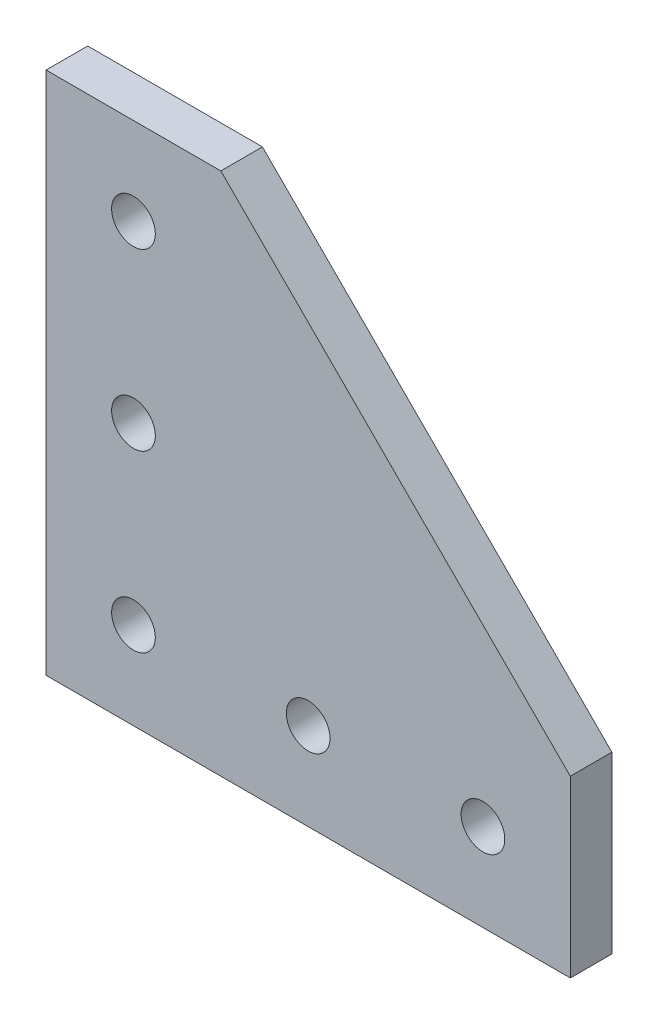
ISO-10303-21;
HEADER;
FILE_DESCRIPTION(('STEP AP214'),'2;1');
FILE_NAME('part.step','',(''),(''),'','','');
FILE_SCHEMA(('AUTOMOTIVE_DESIGN { 1 0 10303 214 1 1 1 1 }'));
ENDSEC;
DATA;
#1=APPLICATION_CONTEXT('core data for automotive mechanical design processes');
#2=APPLICATION_PROTOCOL_DEFINITION('international standard','automotive_design',2000,#1);
#3=PRODUCT_CONTEXT('',#1,'mechanical');
#4=PRODUCT('Part','Part','',(#3));
#5=PRODUCT_RELATED_PRODUCT_CATEGORY('part','',(#4));
#6=PRODUCT_DEFINITION_FORMATION('','',#4);
#7=PRODUCT_DEFINITION_CONTEXT('part definition',#1,'design');
#8=PRODUCT_DEFINITION('design','',#6,#7);
#9=PRODUCT_DEFINITION_SHAPE('','',#8);
#10=(LENGTH_UNIT() NAMED_UNIT(*) SI_UNIT(.MILLI.,.METRE.));
#11=(NAMED_UNIT(*) PLANE_ANGLE_UNIT() SI_UNIT($,.RADIAN.));
#12=(NAMED_UNIT(*) SI_UNIT($,.STERADIAN.) SOLID_ANGLE_UNIT());
#13=UNCERTAINTY_MEASURE_WITH_UNIT(LENGTH_MEASURE(1.E-05),#10,'distance_accuracy_value','');
#14=(GEOMETRIC_REPRESENTATION_CONTEXT(3) GLOBAL_UNCERTAINTY_ASSIGNED_CONTEXT((#13)) GLOBAL_UNIT_ASSIGNED_CONTEXT((#10,
#11,#12)) REPRESENTATION_CONTEXT('',''));
#15=CARTESIAN_POINT('',(0.,0.,0.));
#16=DIRECTION('',(0.,0.,1.));
#17=DIRECTION('',(1.,0.,0.));
#18=AXIS2_PLACEMENT_3D('',#15,#16,#17);
#19=CARTESIAN_POINT('',(0.,0.,4.7625));
#20=DIRECTION('',(0.,0.,1.));
#21=DIRECTION('',(1.,0.,0.));
#22=AXIS2_PLACEMENT_3D('',#19,#20,#21);
#23=PLANE('',#22);
#24=CARTESIAN_POINT('',(9.99999999999993,30.,4.7625));
#25=DIRECTION('',(0.,0.,1.));
#26=DIRECTION('',(1.,0.,0.));
#27=AXIS2_PLACEMENT_3D('',#24,#25,#26);
#28=CIRCLE('',#27,2.5);
#29=CARTESIAN_POINT('',(7.49999999999993,30.,4.7625));
#30=VERTEX_POINT('',#29);
#31=EDGE_CURVE('E179',#30,#30,#28,.T.);
#32=ORIENTED_EDGE('',*,*,#31,.F.);
#33=EDGE_LOOP('',(#32));
#34=FACE_BOUND('',#33,.T.);
#35=CARTESIAN_POINT('',(30.,10.,4.7625));
#36=DIRECTION('',(0.,0.,1.));
#37=DIRECTION('',(1.,0.,0.));
#38=AXIS2_PLACEMENT_3D('',#35,#36,#37);
#39=CIRCLE('',#38,2.5);
#40=CARTESIAN_POINT('',(27.5,10.,4.7625));
#41=VERTEX_POINT('',#40);
#42=EDGE_CURVE('E191',#41,#41,#39,.T.);
#43=ORIENTED_EDGE('',*,*,#42,.F.);
#44=EDGE_LOOP('',(#43));
#45=FACE_BOUND('',#44,.T.);
#46=DIRECTION('',(1.,0.,0.));
#47=VECTOR('',#46,1.);
#48=CARTESIAN_POINT('',(0.,0.,4.7625));
#49=LINE('',#48,#47);
#50=CARTESIAN_POINT('',(0.,0.,4.7625));
#51=VERTEX_POINT('',#50);
#52=CARTESIAN_POINT('',(60.,0.,4.7625));
#53=VERTEX_POINT('',#52);
#54=EDGE_CURVE('E119',#51,#53,#49,.T.);
#55=ORIENTED_EDGE('',*,*,#54,.T.);
#56=DIRECTION('',(0.,1.,0.));
#57=VECTOR('',#56,1.);
#58=CARTESIAN_POINT('',(60.,0.,4.7625));
#59=LINE('',#58,#57);
#60=CARTESIAN_POINT('',(60.,20.,4.7625));
#61=VERTEX_POINT('',#60);
#62=EDGE_CURVE('E86',#53,#61,#59,.T.);
#63=ORIENTED_EDGE('',*,*,#62,.T.);
#64=DIRECTION('',(-0.707106781186548,0.707106781186548,0.));
#65=VECTOR('',#64,1.);
#66=CARTESIAN_POINT('',(20.,60.,4.7625));
#67=LINE('',#66,#65);
#68=CARTESIAN_POINT('',(20.,60.,4.7625));
#69=VERTEX_POINT('',#68);
#70=EDGE_CURVE('E90',#61,#69,#67,.T.);
#71=ORIENTED_EDGE('',*,*,#70,.T.);
#72=DIRECTION('',(-1.,0.,0.));
#73=VECTOR('',#72,1.);
#74=CARTESIAN_POINT('',(0.,60.,4.7625));
#75=LINE('',#74,#73);
#76=CARTESIAN_POINT('',(0.,60.,4.7625));
#77=VERTEX_POINT('',#76);
#78=EDGE_CURVE('E94',#69,#77,#75,.T.);
#79=ORIENTED_EDGE('',*,*,#78,.T.);
#80=DIRECTION('',(0.,-1.,0.));
#81=VECTOR('',#80,1.);
#82=CARTESIAN_POINT('',(0.,0.,4.7625));
#83=LINE('',#82,#81);
#84=EDGE_CURVE('E52',#77,#51,#83,.T.);
#85=ORIENTED_EDGE('',*,*,#84,.T.);
#86=EDGE_LOOP('',(#55,#63,#71,#79,#85));
#87=FACE_BOUND('',#86,.T.);
#88=CARTESIAN_POINT('',(10.,10.,4.7625));
#89=DIRECTION('',(0.,0.,1.));
#90=DIRECTION('',(1.,0.,0.));
#91=AXIS2_PLACEMENT_3D('',#88,#89,#90);
#92=CIRCLE('',#91,2.5);
#93=CARTESIAN_POINT('',(7.5,10.,4.7625));
#94=VERTEX_POINT('',#93);
#95=EDGE_CURVE('E114',#94,#94,#92,.T.);
#96=ORIENTED_EDGE('',*,*,#95,.F.);
#97=EDGE_LOOP('',(#96));
#98=FACE_BOUND('',#97,.T.);
#99=CARTESIAN_POINT('',(50.,10.,4.7625));
#100=DIRECTION('',(0.,0.,1.));
#101=DIRECTION('',(1.,0.,0.));
#102=AXIS2_PLACEMENT_3D('',#99,#100,#101);
#103=CIRCLE('',#102,2.5);
#104=CARTESIAN_POINT('',(47.5,10.,4.7625));
#105=VERTEX_POINT('',#104);
#106=EDGE_CURVE('E185',#105,#105,#103,.T.);
#107=ORIENTED_EDGE('',*,*,#106,.F.);
#108=EDGE_LOOP('',(#107));
#109=FACE_BOUND('',#108,.T.);
#110=CARTESIAN_POINT('',(9.99999999999986,50.,4.7625));
#111=DIRECTION('',(0.,0.,1.));
#112=DIRECTION('',(1.,0.,0.));
#113=AXIS2_PLACEMENT_3D('',#110,#111,#112);
#114=CIRCLE('',#113,2.5);
#115=CARTESIAN_POINT('',(7.49999999999986,50.,4.7625));
#116=VERTEX_POINT('',#115);
#117=EDGE_CURVE('E170',#116,#116,#114,.T.);
#118=ORIENTED_EDGE('',*,*,#117,.F.);
#119=EDGE_LOOP('',(#118));
#120=FACE_BOUND('',#119,.T.);
#121=ADVANCED_FACE('F35',(#34,#45,#87,#98,#109,#120),#23,.T.);
#122=CARTESIAN_POINT('',(0.,0.,0.));
#123=DIRECTION('',(0.,0.,1.));
#124=DIRECTION('',(1.,0.,0.));
#125=AXIS2_PLACEMENT_3D('',#122,#123,#124);
#126=PLANE('',#125);
#127=CARTESIAN_POINT('',(9.99999999999993,30.,0.));
#128=DIRECTION('',(0.,0.,1.));
#129=DIRECTION('',(1.,0.,0.));
#130=AXIS2_PLACEMENT_3D('',#127,#128,#129);
#131=CIRCLE('',#130,2.5);
#132=CARTESIAN_POINT('',(7.49999999999993,30.,0.));
#133=VERTEX_POINT('',#132);
#134=EDGE_CURVE('E176',#133,#133,#131,.T.);
#135=ORIENTED_EDGE('',*,*,#134,.T.);
#136=EDGE_LOOP('',(#135));
#137=FACE_BOUND('',#136,.T.);
#138=CARTESIAN_POINT('',(30.,10.,0.));
#139=DIRECTION('',(0.,0.,1.));
#140=DIRECTION('',(1.,0.,0.));
#141=AXIS2_PLACEMENT_3D('',#138,#139,#140);
#142=CIRCLE('',#141,2.5);
#143=CARTESIAN_POINT('',(27.5,10.,0.));
#144=VERTEX_POINT('',#143);
#145=EDGE_CURVE('E188',#144,#144,#142,.T.);
#146=ORIENTED_EDGE('',*,*,#145,.T.);
#147=EDGE_LOOP('',(#146));
#148=FACE_BOUND('',#147,.T.);
#149=DIRECTION('',(1.,0.,0.));
#150=VECTOR('',#149,1.);
#151=CARTESIAN_POINT('',(0.,0.,0.));
#152=LINE('',#151,#150);
#153=CARTESIAN_POINT('',(0.,0.,0.));
#154=VERTEX_POINT('',#153);
#155=CARTESIAN_POINT('',(60.,0.,0.));
#156=VERTEX_POINT('',#155);
#157=EDGE_CURVE('E110',#154,#156,#152,.T.);
#158=ORIENTED_EDGE('',*,*,#157,.F.);
#159=DIRECTION('',(0.,-1.,0.));
#160=VECTOR('',#159,1.);
#161=CARTESIAN_POINT('',(0.,0.,0.));
#162=LINE('',#161,#160);
#163=CARTESIAN_POINT('',(0.,60.,0.));
#164=VERTEX_POINT('',#163);
#165=EDGE_CURVE('E78',#164,#154,#162,.T.);
#166=ORIENTED_EDGE('',*,*,#165,.F.);
#167=DIRECTION('',(-1.,0.,0.));
#168=VECTOR('',#167,1.);
#169=CARTESIAN_POINT('',(0.,60.,0.));
#170=LINE('',#169,#168);
#171=CARTESIAN_POINT('',(20.,60.,0.));
#172=VERTEX_POINT('',#171);
#173=EDGE_CURVE('E72',#172,#164,#170,.T.);
#174=ORIENTED_EDGE('',*,*,#173,.F.);
#175=DIRECTION('',(-0.707106781186548,0.707106781186548,0.));
#176=VECTOR('',#175,1.);
#177=CARTESIAN_POINT('',(20.,60.,0.));
#178=LINE('',#177,#176);
#179=CARTESIAN_POINT('',(60.,20.,0.));
#180=VERTEX_POINT('',#179);
#181=EDGE_CURVE('E101',#180,#172,#178,.T.);
#182=ORIENTED_EDGE('',*,*,#181,.F.);
#183=DIRECTION('',(0.,1.,0.));
#184=VECTOR('',#183,1.);
#185=CARTESIAN_POINT('',(60.,0.,0.));
#186=LINE('',#185,#184);
#187=EDGE_CURVE('E113',#156,#180,#186,.T.);
#188=ORIENTED_EDGE('',*,*,#187,.F.);
#189=EDGE_LOOP('',(#158,#166,#174,#182,#188));
#190=FACE_BOUND('',#189,.T.);
#191=CARTESIAN_POINT('',(10.,10.,0.));
#192=DIRECTION('',(0.,0.,1.));
#193=DIRECTION('',(1.,0.,0.));
#194=AXIS2_PLACEMENT_3D('',#191,#192,#193);
#195=CIRCLE('',#194,2.5);
#196=CARTESIAN_POINT('',(7.5,10.,0.));
#197=VERTEX_POINT('',#196);
#198=EDGE_CURVE('E194',#197,#197,#195,.T.);
#199=ORIENTED_EDGE('',*,*,#198,.T.);
#200=EDGE_LOOP('',(#199));
#201=FACE_BOUND('',#200,.T.);
#202=CARTESIAN_POINT('',(50.,10.,0.));
#203=DIRECTION('',(0.,0.,1.));
#204=DIRECTION('',(1.,0.,0.));
#205=AXIS2_PLACEMENT_3D('',#202,#203,#204);
#206=CIRCLE('',#205,2.5);
#207=CARTESIAN_POINT('',(47.5,10.,0.));
#208=VERTEX_POINT('',#207);
#209=EDGE_CURVE('E182',#208,#208,#206,.T.);
#210=ORIENTED_EDGE('',*,*,#209,.T.);
#211=EDGE_LOOP('',(#210));
#212=FACE_BOUND('',#211,.T.);
#213=CARTESIAN_POINT('',(9.99999999999986,50.,0.));
#214=DIRECTION('',(0.,0.,1.));
#215=DIRECTION('',(1.,0.,0.));
#216=AXIS2_PLACEMENT_3D('',#213,#214,#215);
#217=CIRCLE('',#216,2.5);
#218=CARTESIAN_POINT('',(7.49999999999986,50.,0.));
#219=VERTEX_POINT('',#218);
#220=EDGE_CURVE('E173',#219,#219,#217,.T.);
#221=ORIENTED_EDGE('',*,*,#220,.T.);
#222=EDGE_LOOP('',(#221));
#223=FACE_BOUND('',#222,.T.);
#224=ADVANCED_FACE('F123',(#137,#148,#190,#201,#212,#223),#126,.F.);
#225=CARTESIAN_POINT('',(0.,0.,4.7625));
#226=DIRECTION('',(0.,1.,0.));
#227=DIRECTION('',(0.,0.,1.));
#228=AXIS2_PLACEMENT_3D('',#225,#226,#227);
#229=PLANE('',#228);
#230=ORIENTED_EDGE('',*,*,#157,.T.);
#231=DIRECTION('',(0.,0.,-1.));
#232=VECTOR('',#231,1.);
#233=CARTESIAN_POINT('',(60.,0.,4.7625));
#234=LINE('',#233,#232);
#235=EDGE_CURVE('E11',#53,#156,#234,.T.);
#236=ORIENTED_EDGE('',*,*,#235,.F.);
#237=ORIENTED_EDGE('',*,*,#54,.F.);
#238=DIRECTION('',(0.,0.,-1.));
#239=VECTOR('',#238,1.);
#240=CARTESIAN_POINT('',(0.,0.,4.7625));
#241=LINE('',#240,#239);
#242=EDGE_CURVE('E106',#51,#154,#241,.T.);
#243=ORIENTED_EDGE('',*,*,#242,.T.);
#244=EDGE_LOOP('',(#230,#236,#237,#243));
#245=FACE_BOUND('',#244,.T.);
#246=ADVANCED_FACE('F37',(#245),#229,.F.);
#247=CARTESIAN_POINT('',(60.,0.,4.7625));
#248=DIRECTION('',(-1.,0.,0.));
#249=DIRECTION('',(0.,0.,1.));
#250=AXIS2_PLACEMENT_3D('',#247,#248,#249);
#251=PLANE('',#250);
#252=ORIENTED_EDGE('',*,*,#187,.T.);
#253=DIRECTION('',(0.,0.,-1.));
#254=VECTOR('',#253,1.);
#255=CARTESIAN_POINT('',(60.,20.,4.7625));
#256=LINE('',#255,#254);
#257=EDGE_CURVE('E44',#61,#180,#256,.T.);
#258=ORIENTED_EDGE('',*,*,#257,.F.);
#259=ORIENTED_EDGE('',*,*,#62,.F.);
#260=ORIENTED_EDGE('',*,*,#235,.T.);
#261=EDGE_LOOP('',(#252,#258,#259,#260));
#262=FACE_BOUND('',#261,.T.);
#263=ADVANCED_FACE('F251',(#262),#251,.F.);
#264=CARTESIAN_POINT('',(20.,60.,4.7625));
#265=DIRECTION('',(-0.707106781186548,-0.707106781186548,0.));
#266=DIRECTION('',(0.707106781186548,-0.707106781186548,0.));
#267=AXIS2_PLACEMENT_3D('',#264,#265,#266);
#268=PLANE('',#267);
#269=ORIENTED_EDGE('',*,*,#181,.T.);
#270=DIRECTION('',(0.,0.,-1.));
#271=VECTOR('',#270,1.);
#272=CARTESIAN_POINT('',(20.,60.,4.7625));
#273=LINE('',#272,#271);
#274=EDGE_CURVE('E98',#69,#172,#273,.T.);
#275=ORIENTED_EDGE('',*,*,#274,.F.);
#276=ORIENTED_EDGE('',*,*,#70,.F.);
#277=ORIENTED_EDGE('',*,*,#257,.T.);
#278=EDGE_LOOP('',(#269,#275,#276,#277));
#279=FACE_BOUND('',#278,.T.);
#280=ADVANCED_FACE('F99',(#279),#268,.F.);
#281=CARTESIAN_POINT('',(0.,60.,4.7625));
#282=DIRECTION('',(0.,-1.,0.));
#283=DIRECTION('',(0.,0.,-1.));
#284=AXIS2_PLACEMENT_3D('',#281,#282,#283);
#285=PLANE('',#284);
#286=ORIENTED_EDGE('',*,*,#173,.T.);
#287=DIRECTION('',(0.,0.,-1.));
#288=VECTOR('',#287,1.);
#289=CARTESIAN_POINT('',(0.,60.,4.7625));
#290=LINE('',#289,#288);
#291=EDGE_CURVE('E102',#77,#164,#290,.T.);
#292=ORIENTED_EDGE('',*,*,#291,.F.);
#293=ORIENTED_EDGE('',*,*,#78,.F.);
#294=ORIENTED_EDGE('',*,*,#274,.T.);
#295=EDGE_LOOP('',(#286,#292,#293,#294));
#296=FACE_BOUND('',#295,.T.);
#297=ADVANCED_FACE('F104',(#296),#285,.F.);
#298=CARTESIAN_POINT('',(0.,0.,4.7625));
#299=DIRECTION('',(1.,0.,0.));
#300=DIRECTION('',(0.,0.,-1.));
#301=AXIS2_PLACEMENT_3D('',#298,#299,#300);
#302=PLANE('',#301);
#303=ORIENTED_EDGE('',*,*,#165,.T.);
#304=ORIENTED_EDGE('',*,*,#242,.F.);
#305=ORIENTED_EDGE('',*,*,#84,.F.);
#306=ORIENTED_EDGE('',*,*,#291,.T.);
#307=EDGE_LOOP('',(#303,#304,#305,#306));
#308=FACE_BOUND('',#307,.T.);
#309=ADVANCED_FACE('F128',(#308),#302,.F.);
#310=CARTESIAN_POINT('',(10.,10.,4.7625));
#311=DIRECTION('',(0.,0.,-1.));
#312=DIRECTION('',(-1.,0.,0.));
#313=AXIS2_PLACEMENT_3D('',#310,#311,#312);
#314=CYLINDRICAL_SURFACE('',#313,2.5);
#315=CARTESIAN_POINT('',(7.5,10.,4.7625));
#316=CARTESIAN_POINT('',(7.5,10.,4.712890625));
#317=CARTESIAN_POINT('',(7.5,10.,4.66328125));
#318=CARTESIAN_POINT('',(7.5,10.,4.5640625));
#319=CARTESIAN_POINT('',(7.5,10.,4.514453125));
#320=CARTESIAN_POINT('',(7.5,10.,4.415234375));
#321=CARTESIAN_POINT('',(7.5,10.,4.365625));
#322=CARTESIAN_POINT('',(7.5,10.,4.26640625));
#323=CARTESIAN_POINT('',(7.5,10.,4.216796875));
#324=CARTESIAN_POINT('',(7.5,10.,4.117578125));
#325=CARTESIAN_POINT('',(7.5,10.,4.06796875));
#326=CARTESIAN_POINT('',(7.5,10.,3.96875));
#327=CARTESIAN_POINT('',(7.5,10.,3.919140625));
#328=CARTESIAN_POINT('',(7.5,10.,3.819921875));
#329=CARTESIAN_POINT('',(7.5,10.,3.7703125));
#330=CARTESIAN_POINT('',(7.5,10.,3.67109375));
#331=CARTESIAN_POINT('',(7.5,10.,3.621484375));
#332=CARTESIAN_POINT('',(7.5,10.,3.522265625));
#333=CARTESIAN_POINT('',(7.5,10.,3.47265625));
#334=CARTESIAN_POINT('',(7.5,10.,3.3734375));
#335=CARTESIAN_POINT('',(7.5,10.,3.323828125));
#336=CARTESIAN_POINT('',(7.5,10.,3.224609375));
#337=CARTESIAN_POINT('',(7.5,10.,3.175));
#338=CARTESIAN_POINT('',(7.5,10.,3.07578125));
#339=CARTESIAN_POINT('',(7.5,10.,3.026171875));
#340=CARTESIAN_POINT('',(7.5,10.,2.926953125));
#341=CARTESIAN_POINT('',(7.5,10.,2.87734375));
#342=CARTESIAN_POINT('',(7.5,10.,2.778125));
#343=CARTESIAN_POINT('',(7.5,10.,2.728515625));
#344=CARTESIAN_POINT('',(7.5,10.,2.629296875));
#345=CARTESIAN_POINT('',(7.5,10.,2.5796875));
#346=CARTESIAN_POINT('',(7.5,10.,2.48046875));
#347=CARTESIAN_POINT('',(7.5,10.,2.430859375));
#348=CARTESIAN_POINT('',(7.5,10.,2.331640625));
#349=CARTESIAN_POINT('',(7.5,10.,2.28203125));
#350=CARTESIAN_POINT('',(7.5,10.,2.1828125));
#351=CARTESIAN_POINT('',(7.5,10.,2.133203125));
#352=CARTESIAN_POINT('',(7.5,10.,2.033984375));
#353=CARTESIAN_POINT('',(7.5,10.,1.984375));
#354=CARTESIAN_POINT('',(7.5,10.,1.88515625));
#355=CARTESIAN_POINT('',(7.5,10.,1.835546875));
#356=CARTESIAN_POINT('',(7.5,10.,1.736328125));
#357=CARTESIAN_POINT('',(7.5,10.,1.68671875));
#358=CARTESIAN_POINT('',(7.5,10.,1.5875));
#359=CARTESIAN_POINT('',(7.5,10.,1.537890625));
#360=CARTESIAN_POINT('',(7.5,10.,1.438671875));
#361=CARTESIAN_POINT('',(7.5,10.,1.3890625));
#362=CARTESIAN_POINT('',(7.5,10.,1.28984375));
#363=CARTESIAN_POINT('',(7.5,10.,1.240234375));
#364=CARTESIAN_POINT('',(7.5,10.,1.141015625));
#365=CARTESIAN_POINT('',(7.5,10.,1.09140625));
#366=CARTESIAN_POINT('',(7.5,10.,0.992187499999999));
#367=CARTESIAN_POINT('',(7.5,10.,0.942578124999999));
#368=CARTESIAN_POINT('',(7.5,10.,0.843359375));
#369=CARTESIAN_POINT('',(7.5,10.,0.79375));
#370=CARTESIAN_POINT('',(7.5,10.,0.69453125));
#371=CARTESIAN_POINT('',(7.5,10.,0.644921875));
#372=CARTESIAN_POINT('',(7.5,10.,0.545703125));
#373=CARTESIAN_POINT('',(7.5,10.,0.49609375));
#374=CARTESIAN_POINT('',(7.5,10.,0.396875));
#375=CARTESIAN_POINT('',(7.5,10.,0.347265625));
#376=CARTESIAN_POINT('',(7.5,10.,0.248046875));
#377=CARTESIAN_POINT('',(7.5,10.,0.1984375));
#378=CARTESIAN_POINT('',(7.5,10.,0.09921875));
#379=CARTESIAN_POINT('',(7.5,10.,0.049609375));
#380=CARTESIAN_POINT('',(7.5,10.,0.));
#381=B_SPLINE_CURVE_WITH_KNOTS('',3,(#315,#316,#317,#318,#319,#320,#321,#322,#323,#324,#325,
#326,#327,#328,#329,#330,#331,#332,#333,#334,#335,#336,#337,#338,#339,#340,#341,#342,#343,#344,
#345,#346,#347,#348,#349,#350,#351,#352,#353,#354,#355,#356,#357,#358,#359,#360,#361,#362,#363,
#364,#365,#366,#367,#368,#369,#370,#371,#372,#373,#374,#375,#376,#377,#378,#379,#380),
.UNSPECIFIED.,.F.,.F.,(4,2,2,2,2,2,2,2,2,2,2,2,2,2,2,2,2,2,2,2,2,2,2,2,2,2,2,2,2,2,2,2,4),(0.,
0.148828125,0.29765625,0.446484375,0.5953125,0.744140625,0.892968750000001,1.041796875,1.190625,
1.339453125,1.48828125,1.637109375,1.7859375,1.934765625,2.08359375,2.232421875,2.38125,
2.530078125,2.67890625,2.827734375,2.9765625,3.125390625,3.27421875,3.423046875,3.571875,
3.720703125,3.86953125,4.018359375,4.1671875,4.316015625,4.46484375,4.613671875,4.7625),.UNSPECIFIED.);
#382=EDGE_CURVE('BSEAM130',#94,#197,#381,.T.);
#383=ORIENTED_EDGE('',*,*,#95,.T.);
#384=ORIENTED_EDGE('',*,*,#198,.F.);
#385=ORIENTED_EDGE('',*,*,#382,.T.);
#386=ORIENTED_EDGE('',*,*,#382,.F.);
#387=EDGE_LOOP('',(#383,#385,#384,#386));
#388=FACE_BOUND('',#387,.T.);
#389=ADVANCED_FACE('F130',(#388),#314,.F.);
#390=CARTESIAN_POINT('',(30.,10.,4.7625));
#391=DIRECTION('',(0.,0.,-1.));
#392=DIRECTION('',(-1.,0.,0.));
#393=AXIS2_PLACEMENT_3D('',#390,#391,#392);
#394=CYLINDRICAL_SURFACE('',#393,2.5);
#395=CARTESIAN_POINT('',(27.5,10.,4.7625));
#396=CARTESIAN_POINT('',(27.5,10.,4.712890625));
#397=CARTESIAN_POINT('',(27.5,10.,4.66328125));
#398=CARTESIAN_POINT('',(27.5,10.,4.5640625));
#399=CARTESIAN_POINT('',(27.5,10.,4.514453125));
#400=CARTESIAN_POINT('',(27.5,10.,4.415234375));
#401=CARTESIAN_POINT('',(27.5,10.,4.365625));
#402=CARTESIAN_POINT('',(27.5,10.,4.26640625));
#403=CARTESIAN_POINT('',(27.5,10.,4.216796875));
#404=CARTESIAN_POINT('',(27.5,10.,4.117578125));
#405=CARTESIAN_POINT('',(27.5,10.,4.06796875));
#406=CARTESIAN_POINT('',(27.5,10.,3.96875));
#407=CARTESIAN_POINT('',(27.5,10.,3.919140625));
#408=CARTESIAN_POINT('',(27.5,10.,3.819921875));
#409=CARTESIAN_POINT('',(27.5,10.,3.7703125));
#410=CARTESIAN_POINT('',(27.5,10.,3.67109375));
#411=CARTESIAN_POINT('',(27.5,10.,3.621484375));
#412=CARTESIAN_POINT('',(27.5,10.,3.522265625));
#413=CARTESIAN_POINT('',(27.5,10.,3.47265625));
#414=CARTESIAN_POINT('',(27.5,10.,3.3734375));
#415=CARTESIAN_POINT('',(27.5,10.,3.323828125));
#416=CARTESIAN_POINT('',(27.5,10.,3.224609375));
#417=CARTESIAN_POINT('',(27.5,10.,3.175));
#418=CARTESIAN_POINT('',(27.5,10.,3.07578125));
#419=CARTESIAN_POINT('',(27.5,10.,3.026171875));
#420=CARTESIAN_POINT('',(27.5,10.,2.926953125));
#421=CARTESIAN_POINT('',(27.5,10.,2.87734375));
#422=CARTESIAN_POINT('',(27.5,10.,2.778125));
#423=CARTESIAN_POINT('',(27.5,10.,2.728515625));
#424=CARTESIAN_POINT('',(27.5,10.,2.629296875));
#425=CARTESIAN_POINT('',(27.5,10.,2.5796875));
#426=CARTESIAN_POINT('',(27.5,10.,2.48046875));
#427=CARTESIAN_POINT('',(27.5,10.,2.430859375));
#428=CARTESIAN_POINT('',(27.5,10.,2.331640625));
#429=CARTESIAN_POINT('',(27.5,10.,2.28203125));
#430=CARTESIAN_POINT('',(27.5,10.,2.1828125));
#431=CARTESIAN_POINT('',(27.5,10.,2.133203125));
#432=CARTESIAN_POINT('',(27.5,10.,2.033984375));
#433=CARTESIAN_POINT('',(27.5,10.,1.984375));
#434=CARTESIAN_POINT('',(27.5,10.,1.88515625));
#435=CARTESIAN_POINT('',(27.5,10.,1.835546875));
#436=CARTESIAN_POINT('',(27.5,10.,1.736328125));
#437=CARTESIAN_POINT('',(27.5,10.,1.68671875));
#438=CARTESIAN_POINT('',(27.5,10.,1.5875));
#439=CARTESIAN_POINT('',(27.5,10.,1.537890625));
#440=CARTESIAN_POINT('',(27.5,10.,1.438671875));
#441=CARTESIAN_POINT('',(27.5,10.,1.3890625));
#442=CARTESIAN_POINT('',(27.5,10.,1.28984375));
#443=CARTESIAN_POINT('',(27.5,10.,1.240234375));
#444=CARTESIAN_POINT('',(27.5,10.,1.141015625));
#445=CARTESIAN_POINT('',(27.5,10.,1.09140625));
#446=CARTESIAN_POINT('',(27.5,10.,0.992187499999999));
#447=CARTESIAN_POINT('',(27.5,10.,0.942578124999999));
#448=CARTESIAN_POINT('',(27.5,10.,0.843359375));
#449=CARTESIAN_POINT('',(27.5,10.,0.79375));
#450=CARTESIAN_POINT('',(27.5,10.,0.69453125));
#451=CARTESIAN_POINT('',(27.5,10.,0.644921875));
#452=CARTESIAN_POINT('',(27.5,10.,0.545703125));
#453=CARTESIAN_POINT('',(27.5,10.,0.49609375));
#454=CARTESIAN_POINT('',(27.5,10.,0.396875));
#455=CARTESIAN_POINT('',(27.5,10.,0.347265625));
#456=CARTESIAN_POINT('',(27.5,10.,0.248046875));
#457=CARTESIAN_POINT('',(27.5,10.,0.1984375));
#458=CARTESIAN_POINT('',(27.5,10.,0.09921875));
#459=CARTESIAN_POINT('',(27.5,10.,0.049609375));
#460=CARTESIAN_POINT('',(27.5,10.,0.));
#461=B_SPLINE_CURVE_WITH_KNOTS('',3,(#395,#396,#397,#398,#399,#400,#401,#402,#403,#404,#405,
#406,#407,#408,#409,#410,#411,#412,#413,#414,#415,#416,#417,#418,#419,#420,#421,#422,#423,#424,
#425,#426,#427,#428,#429,#430,#431,#432,#433,#434,#435,#436,#437,#438,#439,#440,#441,#442,#443,
#444,#445,#446,#447,#448,#449,#450,#451,#452,#453,#454,#455,#456,#457,#458,#459,#460),
.UNSPECIFIED.,.F.,.F.,(4,2,2,2,2,2,2,2,2,2,2,2,2,2,2,2,2,2,2,2,2,2,2,2,2,2,2,2,2,2,2,2,4),(0.,
0.148828125,0.29765625,0.446484375,0.5953125,0.744140625,0.892968750000001,1.041796875,1.190625,
1.339453125,1.48828125,1.637109375,1.7859375,1.934765625,2.08359375,2.232421875,2.38125,
2.530078125,2.67890625,2.827734375,2.9765625,3.125390625,3.27421875,3.423046875,3.571875,
3.720703125,3.86953125,4.018359375,4.1671875,4.316015625,4.46484375,4.613671875,4.7625),.UNSPECIFIED.);
#462=EDGE_CURVE('BSEAM136',#41,#144,#461,.T.);
#463=ORIENTED_EDGE('',*,*,#42,.T.);
#464=ORIENTED_EDGE('',*,*,#145,.F.);
#465=ORIENTED_EDGE('',*,*,#462,.T.);
#466=ORIENTED_EDGE('',*,*,#462,.F.);
#467=EDGE_LOOP('',(#463,#465,#464,#466));
#468=FACE_BOUND('',#467,.T.);
#469=ADVANCED_FACE('F136',(#468),#394,.F.);
#470=CARTESIAN_POINT('',(50.,10.,4.7625));
#471=DIRECTION('',(0.,0.,-1.));
#472=DIRECTION('',(-1.,0.,0.));
#473=AXIS2_PLACEMENT_3D('',#470,#471,#472);
#474=CYLINDRICAL_SURFACE('',#473,2.5);
#475=CARTESIAN_POINT('',(47.5,10.,4.7625));
#476=CARTESIAN_POINT('',(47.5,10.,4.712890625));
#477=CARTESIAN_POINT('',(47.5,10.,4.66328125));
#478=CARTESIAN_POINT('',(47.5,10.,4.5640625));
#479=CARTESIAN_POINT('',(47.5,10.,4.514453125));
#480=CARTESIAN_POINT('',(47.5,10.,4.415234375));
#481=CARTESIAN_POINT('',(47.5,10.,4.365625));
#482=CARTESIAN_POINT('',(47.5,10.,4.26640625));
#483=CARTESIAN_POINT('',(47.5,10.,4.216796875));
#484=CARTESIAN_POINT('',(47.5,10.,4.117578125));
#485=CARTESIAN_POINT('',(47.5,10.,4.06796875));
#486=CARTESIAN_POINT('',(47.5,10.,3.96875));
#487=CARTESIAN_POINT('',(47.5,10.,3.919140625));
#488=CARTESIAN_POINT('',(47.5,10.,3.819921875));
#489=CARTESIAN_POINT('',(47.5,10.,3.7703125));
#490=CARTESIAN_POINT('',(47.5,10.,3.67109375));
#491=CARTESIAN_POINT('',(47.5,10.,3.621484375));
#492=CARTESIAN_POINT('',(47.5,10.,3.522265625));
#493=CARTESIAN_POINT('',(47.5,10.,3.47265625));
#494=CARTESIAN_POINT('',(47.5,10.,3.3734375));
#495=CARTESIAN_POINT('',(47.5,10.,3.323828125));
#496=CARTESIAN_POINT('',(47.5,10.,3.224609375));
#497=CARTESIAN_POINT('',(47.5,10.,3.175));
#498=CARTESIAN_POINT('',(47.5,10.,3.07578125));
#499=CARTESIAN_POINT('',(47.5,10.,3.026171875));
#500=CARTESIAN_POINT('',(47.5,10.,2.926953125));
#501=CARTESIAN_POINT('',(47.5,10.,2.87734375));
#502=CARTESIAN_POINT('',(47.5,10.,2.778125));
#503=CARTESIAN_POINT('',(47.5,10.,2.728515625));
#504=CARTESIAN_POINT('',(47.5,10.,2.629296875));
#505=CARTESIAN_POINT('',(47.5,10.,2.5796875));
#506=CARTESIAN_POINT('',(47.5,10.,2.48046875));
#507=CARTESIAN_POINT('',(47.5,10.,2.430859375));
#508=CARTESIAN_POINT('',(47.5,10.,2.331640625));
#509=CARTESIAN_POINT('',(47.5,10.,2.28203125));
#510=CARTESIAN_POINT('',(47.5,10.,2.1828125));
#511=CARTESIAN_POINT('',(47.5,10.,2.133203125));
#512=CARTESIAN_POINT('',(47.5,10.,2.033984375));
#513=CARTESIAN_POINT('',(47.5,10.,1.984375));
#514=CARTESIAN_POINT('',(47.5,10.,1.88515625));
#515=CARTESIAN_POINT('',(47.5,10.,1.835546875));
#516=CARTESIAN_POINT('',(47.5,10.,1.736328125));
#517=CARTESIAN_POINT('',(47.5,10.,1.68671875));
#518=CARTESIAN_POINT('',(47.5,10.,1.5875));
#519=CARTESIAN_POINT('',(47.5,10.,1.537890625));
#520=CARTESIAN_POINT('',(47.5,10.,1.438671875));
#521=CARTESIAN_POINT('',(47.5,10.,1.3890625));
#522=CARTESIAN_POINT('',(47.5,10.,1.28984375));
#523=CARTESIAN_POINT('',(47.5,10.,1.240234375));
#524=CARTESIAN_POINT('',(47.5,10.,1.141015625));
#525=CARTESIAN_POINT('',(47.5,10.,1.09140625));
#526=CARTESIAN_POINT('',(47.5,10.,0.992187499999999));
#527=CARTESIAN_POINT('',(47.5,10.,0.942578124999999));
#528=CARTESIAN_POINT('',(47.5,10.,0.843359375));
#529=CARTESIAN_POINT('',(47.5,10.,0.79375));
#530=CARTESIAN_POINT('',(47.5,10.,0.69453125));
#531=CARTESIAN_POINT('',(47.5,10.,0.644921875));
#532=CARTESIAN_POINT('',(47.5,10.,0.545703125));
#533=CARTESIAN_POINT('',(47.5,10.,0.49609375));
#534=CARTESIAN_POINT('',(47.5,10.,0.396875));
#535=CARTESIAN_POINT('',(47.5,10.,0.347265625));
#536=CARTESIAN_POINT('',(47.5,10.,0.248046875));
#537=CARTESIAN_POINT('',(47.5,10.,0.1984375));
#538=CARTESIAN_POINT('',(47.5,10.,0.09921875));
#539=CARTESIAN_POINT('',(47.5,10.,0.049609375));
#540=CARTESIAN_POINT('',(47.5,10.,0.));
#541=B_SPLINE_CURVE_WITH_KNOTS('',3,(#475,#476,#477,#478,#479,#480,#481,#482,#483,#484,#485,
#486,#487,#488,#489,#490,#491,#492,#493,#494,#495,#496,#497,#498,#499,#500,#501,#502,#503,#504,
#505,#506,#507,#508,#509,#510,#511,#512,#513,#514,#515,#516,#517,#518,#519,#520,#521,#522,#523,
#524,#525,#526,#527,#528,#529,#530,#531,#532,#533,#534,#535,#536,#537,#538,#539,#540),
.UNSPECIFIED.,.F.,.F.,(4,2,2,2,2,2,2,2,2,2,2,2,2,2,2,2,2,2,2,2,2,2,2,2,2,2,2,2,2,2,2,2,4),(0.,
0.148828125,0.29765625,0.446484375,0.5953125,0.744140625,0.892968750000001,1.041796875,1.190625,
1.339453125,1.48828125,1.637109375,1.7859375,1.934765625,2.08359375,2.232421875,2.38125,
2.530078125,2.67890625,2.827734375,2.9765625,3.125390625,3.27421875,3.423046875,3.571875,
3.720703125,3.86953125,4.018359375,4.1671875,4.316015625,4.46484375,4.613671875,4.7625),.UNSPECIFIED.);
#542=EDGE_CURVE('BSEAM153',#105,#208,#541,.T.);
#543=ORIENTED_EDGE('',*,*,#106,.T.);
#544=ORIENTED_EDGE('',*,*,#209,.F.);
#545=ORIENTED_EDGE('',*,*,#542,.T.);
#546=ORIENTED_EDGE('',*,*,#542,.F.);
#547=EDGE_LOOP('',(#543,#545,#544,#546));
#548=FACE_BOUND('',#547,.T.);
#549=ADVANCED_FACE('F153',(#548),#474,.F.);
#550=CARTESIAN_POINT('',(9.99999999999993,30.,4.7625));
#551=DIRECTION('',(0.,0.,-1.));
#552=DIRECTION('',(-1.,0.,0.));
#553=AXIS2_PLACEMENT_3D('',#550,#551,#552);
#554=CYLINDRICAL_SURFACE('',#553,2.5);
#555=CARTESIAN_POINT('',(7.49999999999993,30.,4.7625));
#556=CARTESIAN_POINT('',(7.49999999999993,30.,4.712890625));
#557=CARTESIAN_POINT('',(7.49999999999993,30.,4.66328125));
#558=CARTESIAN_POINT('',(7.49999999999993,30.,4.5640625));
#559=CARTESIAN_POINT('',(7.49999999999993,30.,4.514453125));
#560=CARTESIAN_POINT('',(7.49999999999993,30.,4.415234375));
#561=CARTESIAN_POINT('',(7.49999999999993,30.,4.365625));
#562=CARTESIAN_POINT('',(7.49999999999993,30.,4.26640625));
#563=CARTESIAN_POINT('',(7.49999999999993,30.,4.216796875));
#564=CARTESIAN_POINT('',(7.49999999999993,30.,4.117578125));
#565=CARTESIAN_POINT('',(7.49999999999993,30.,4.06796875));
#566=CARTESIAN_POINT('',(7.49999999999993,30.,3.96875));
#567=CARTESIAN_POINT('',(7.49999999999993,30.,3.919140625));
#568=CARTESIAN_POINT('',(7.49999999999993,30.,3.819921875));
#569=CARTESIAN_POINT('',(7.49999999999993,30.,3.7703125));
#570=CARTESIAN_POINT('',(7.49999999999993,30.,3.67109375));
#571=CARTESIAN_POINT('',(7.49999999999993,30.,3.621484375));
#572=CARTESIAN_POINT('',(7.49999999999993,30.,3.522265625));
#573=CARTESIAN_POINT('',(7.49999999999993,30.,3.47265625));
#574=CARTESIAN_POINT('',(7.49999999999993,30.,3.3734375));
#575=CARTESIAN_POINT('',(7.49999999999993,30.,3.323828125));
#576=CARTESIAN_POINT('',(7.49999999999993,30.,3.224609375));
#577=CARTESIAN_POINT('',(7.49999999999993,30.,3.175));
#578=CARTESIAN_POINT('',(7.49999999999993,30.,3.07578125));
#579=CARTESIAN_POINT('',(7.49999999999993,30.,3.026171875));
#580=CARTESIAN_POINT('',(7.49999999999993,30.,2.926953125));
#581=CARTESIAN_POINT('',(7.49999999999993,30.,2.87734375));
#582=CARTESIAN_POINT('',(7.49999999999993,30.,2.778125));
#583=CARTESIAN_POINT('',(7.49999999999993,30.,2.728515625));
#584=CARTESIAN_POINT('',(7.49999999999993,30.,2.629296875));
#585=CARTESIAN_POINT('',(7.49999999999993,30.,2.5796875));
#586=CARTESIAN_POINT('',(7.49999999999993,30.,2.48046875));
#587=CARTESIAN_POINT('',(7.49999999999993,30.,2.430859375));
#588=CARTESIAN_POINT('',(7.49999999999993,30.,2.331640625));
#589=CARTESIAN_POINT('',(7.49999999999993,30.,2.28203125));
#590=CARTESIAN_POINT('',(7.49999999999993,30.,2.1828125));
#591=CARTESIAN_POINT('',(7.49999999999993,30.,2.133203125));
#592=CARTESIAN_POINT('',(7.49999999999993,30.,2.033984375));
#593=CARTESIAN_POINT('',(7.49999999999993,30.,1.984375));
#594=CARTESIAN_POINT('',(7.49999999999993,30.,1.88515625));
#595=CARTESIAN_POINT('',(7.49999999999993,30.,1.835546875));
#596=CARTESIAN_POINT('',(7.49999999999993,30.,1.736328125));
#597=CARTESIAN_POINT('',(7.49999999999993,30.,1.68671875));
#598=CARTESIAN_POINT('',(7.49999999999993,30.,1.5875));
#599=CARTESIAN_POINT('',(7.49999999999993,30.,1.537890625));
#600=CARTESIAN_POINT('',(7.49999999999993,30.,1.438671875));
#601=CARTESIAN_POINT('',(7.49999999999993,30.,1.3890625));
#602=CARTESIAN_POINT('',(7.49999999999993,30.,1.28984375));
#603=CARTESIAN_POINT('',(7.49999999999993,30.,1.240234375));
#604=CARTESIAN_POINT('',(7.49999999999993,30.,1.141015625));
#605=CARTESIAN_POINT('',(7.49999999999993,30.,1.09140625));
#606=CARTESIAN_POINT('',(7.49999999999993,30.,0.992187499999999));
#607=CARTESIAN_POINT('',(7.49999999999993,30.,0.942578124999999));
#608=CARTESIAN_POINT('',(7.49999999999993,30.,0.843359375));
#609=CARTESIAN_POINT('',(7.49999999999993,30.,0.79375));
#610=CARTESIAN_POINT('',(7.49999999999993,30.,0.69453125));
#611=CARTESIAN_POINT('',(7.49999999999993,30.,0.644921875));
#612=CARTESIAN_POINT('',(7.49999999999993,30.,0.545703125));
#613=CARTESIAN_POINT('',(7.49999999999993,30.,0.49609375));
#614=CARTESIAN_POINT('',(7.49999999999993,30.,0.396875));
#615=CARTESIAN_POINT('',(7.49999999999993,30.,0.347265625));
#616=CARTESIAN_POINT('',(7.49999999999993,30.,0.248046875));
#617=CARTESIAN_POINT('',(7.49999999999993,30.,0.1984375));
#618=CARTESIAN_POINT('',(7.49999999999993,30.,0.09921875));
#619=CARTESIAN_POINT('',(7.49999999999993,30.,0.049609375));
#620=CARTESIAN_POINT('',(7.49999999999993,30.,0.));
#621=B_SPLINE_CURVE_WITH_KNOTS('',3,(#555,#556,#557,#558,#559,#560,#561,#562,#563,#564,#565,
#566,#567,#568,#569,#570,#571,#572,#573,#574,#575,#576,#577,#578,#579,#580,#581,#582,#583,#584,
#585,#586,#587,#588,#589,#590,#591,#592,#593,#594,#595,#596,#597,#598,#599,#600,#601,#602,#603,
#604,#605,#606,#607,#608,#609,#610,#611,#612,#613,#614,#615,#616,#617,#618,#619,#620),
.UNSPECIFIED.,.F.,.F.,(4,2,2,2,2,2,2,2,2,2,2,2,2,2,2,2,2,2,2,2,2,2,2,2,2,2,2,2,2,2,2,2,4),(0.,
0.148828125,0.29765625,0.446484375,0.5953125,0.744140625,0.892968750000001,1.041796875,1.190625,
1.339453125,1.48828125,1.637109375,1.7859375,1.934765625,2.08359375,2.232421875,2.38125,
2.530078125,2.67890625,2.827734375,2.9765625,3.125390625,3.27421875,3.423046875,3.571875,
3.720703125,3.86953125,4.018359375,4.1671875,4.316015625,4.46484375,4.613671875,4.7625),.UNSPECIFIED.);
#622=EDGE_CURVE('BSEAM157',#30,#133,#621,.T.);
#623=ORIENTED_EDGE('',*,*,#31,.T.);
#624=ORIENTED_EDGE('',*,*,#134,.F.);
#625=ORIENTED_EDGE('',*,*,#622,.T.);
#626=ORIENTED_EDGE('',*,*,#622,.F.);
#627=EDGE_LOOP('',(#623,#625,#624,#626));
#628=FACE_BOUND('',#627,.T.);
#629=ADVANCED_FACE('F157',(#628),#554,.F.);
#630=CARTESIAN_POINT('',(9.99999999999986,50.,4.7625));
#631=DIRECTION('',(0.,0.,-1.));
#632=DIRECTION('',(-1.,0.,0.));
#633=AXIS2_PLACEMENT_3D('',#630,#631,#632);
#634=CYLINDRICAL_SURFACE('',#633,2.5);
#635=CARTESIAN_POINT('',(7.49999999999986,50.,4.7625));
#636=CARTESIAN_POINT('',(7.49999999999986,50.,4.712890625));
#637=CARTESIAN_POINT('',(7.49999999999986,50.,4.66328125));
#638=CARTESIAN_POINT('',(7.49999999999986,50.,4.5640625));
#639=CARTESIAN_POINT('',(7.49999999999986,50.,4.514453125));
#640=CARTESIAN_POINT('',(7.49999999999986,50.,4.415234375));
#641=CARTESIAN_POINT('',(7.49999999999986,50.,4.365625));
#642=CARTESIAN_POINT('',(7.49999999999986,50.,4.26640625));
#643=CARTESIAN_POINT('',(7.49999999999986,50.,4.216796875));
#644=CARTESIAN_POINT('',(7.49999999999986,50.,4.117578125));
#645=CARTESIAN_POINT('',(7.49999999999986,50.,4.06796875));
#646=CARTESIAN_POINT('',(7.49999999999986,50.,3.96875));
#647=CARTESIAN_POINT('',(7.49999999999986,50.,3.919140625));
#648=CARTESIAN_POINT('',(7.49999999999986,50.,3.819921875));
#649=CARTESIAN_POINT('',(7.49999999999986,50.,3.7703125));
#650=CARTESIAN_POINT('',(7.49999999999986,50.,3.67109375));
#651=CARTESIAN_POINT('',(7.49999999999986,50.,3.621484375));
#652=CARTESIAN_POINT('',(7.49999999999986,50.,3.522265625));
#653=CARTESIAN_POINT('',(7.49999999999986,50.,3.47265625));
#654=CARTESIAN_POINT('',(7.49999999999986,50.,3.3734375));
#655=CARTESIAN_POINT('',(7.49999999999986,50.,3.323828125));
#656=CARTESIAN_POINT('',(7.49999999999986,50.,3.224609375));
#657=CARTESIAN_POINT('',(7.49999999999986,50.,3.175));
#658=CARTESIAN_POINT('',(7.49999999999986,50.,3.07578125));
#659=CARTESIAN_POINT('',(7.49999999999986,50.,3.026171875));
#660=CARTESIAN_POINT('',(7.49999999999986,50.,2.926953125));
#661=CARTESIAN_POINT('',(7.49999999999986,50.,2.87734375));
#662=CARTESIAN_POINT('',(7.49999999999986,50.,2.778125));
#663=CARTESIAN_POINT('',(7.49999999999986,50.,2.728515625));
#664=CARTESIAN_POINT('',(7.49999999999986,50.,2.629296875));
#665=CARTESIAN_POINT('',(7.49999999999986,50.,2.5796875));
#666=CARTESIAN_POINT('',(7.49999999999986,50.,2.48046875));
#667=CARTESIAN_POINT('',(7.49999999999986,50.,2.430859375));
#668=CARTESIAN_POINT('',(7.49999999999986,50.,2.331640625));
#669=CARTESIAN_POINT('',(7.49999999999986,50.,2.28203125));
#670=CARTESIAN_POINT('',(7.49999999999986,50.,2.1828125));
#671=CARTESIAN_POINT('',(7.49999999999986,50.,2.133203125));
#672=CARTESIAN_POINT('',(7.49999999999986,50.,2.033984375));
#673=CARTESIAN_POINT('',(7.49999999999986,50.,1.984375));
#674=CARTESIAN_POINT('',(7.49999999999986,50.,1.88515625));
#675=CARTESIAN_POINT('',(7.49999999999986,50.,1.835546875));
#676=CARTESIAN_POINT('',(7.49999999999986,50.,1.736328125));
#677=CARTESIAN_POINT('',(7.49999999999986,50.,1.68671875));
#678=CARTESIAN_POINT('',(7.49999999999986,50.,1.5875));
#679=CARTESIAN_POINT('',(7.49999999999986,50.,1.537890625));
#680=CARTESIAN_POINT('',(7.49999999999986,50.,1.438671875));
#681=CARTESIAN_POINT('',(7.49999999999986,50.,1.3890625));
#682=CARTESIAN_POINT('',(7.49999999999986,50.,1.28984375));
#683=CARTESIAN_POINT('',(7.49999999999986,50.,1.240234375));
#684=CARTESIAN_POINT('',(7.49999999999986,50.,1.141015625));
#685=CARTESIAN_POINT('',(7.49999999999986,50.,1.09140625));
#686=CARTESIAN_POINT('',(7.49999999999986,50.,0.992187499999999));
#687=CARTESIAN_POINT('',(7.49999999999986,50.,0.942578124999999));
#688=CARTESIAN_POINT('',(7.49999999999986,50.,0.843359375));
#689=CARTESIAN_POINT('',(7.49999999999986,50.,0.79375));
#690=CARTESIAN_POINT('',(7.49999999999986,50.,0.69453125));
#691=CARTESIAN_POINT('',(7.49999999999986,50.,0.644921875));
#692=CARTESIAN_POINT('',(7.49999999999986,50.,0.545703125));
#693=CARTESIAN_POINT('',(7.49999999999986,50.,0.49609375));
#694=CARTESIAN_POINT('',(7.49999999999986,50.,0.396875));
#695=CARTESIAN_POINT('',(7.49999999999986,50.,0.347265625));
#696=CARTESIAN_POINT('',(7.49999999999986,50.,0.248046875));
#697=CARTESIAN_POINT('',(7.49999999999986,50.,0.1984375));
#698=CARTESIAN_POINT('',(7.49999999999986,50.,0.09921875));
#699=CARTESIAN_POINT('',(7.49999999999986,50.,0.049609375));
#700=CARTESIAN_POINT('',(7.49999999999986,50.,0.));
#701=B_SPLINE_CURVE_WITH_KNOTS('',3,(#635,#636,#637,#638,#639,#640,#641,#642,#643,#644,#645,
#646,#647,#648,#649,#650,#651,#652,#653,#654,#655,#656,#657,#658,#659,#660,#661,#662,#663,#664,
#665,#666,#667,#668,#669,#670,#671,#672,#673,#674,#675,#676,#677,#678,#679,#680,#681,#682,#683,
#684,#685,#686,#687,#688,#689,#690,#691,#692,#693,#694,#695,#696,#697,#698,#699,#700),
.UNSPECIFIED.,.F.,.F.,(4,2,2,2,2,2,2,2,2,2,2,2,2,2,2,2,2,2,2,2,2,2,2,2,2,2,2,2,2,2,2,2,4),(0.,
0.148828125,0.29765625,0.446484375,0.5953125,0.744140625,0.892968750000001,1.041796875,1.190625,
1.339453125,1.48828125,1.637109375,1.7859375,1.934765625,2.08359375,2.232421875,2.38125,
2.530078125,2.67890625,2.827734375,2.9765625,3.125390625,3.27421875,3.423046875,3.571875,
3.720703125,3.86953125,4.018359375,4.1671875,4.316015625,4.46484375,4.613671875,4.7625),.UNSPECIFIED.);
#702=EDGE_CURVE('BSEAM161',#116,#219,#701,.T.);
#703=ORIENTED_EDGE('',*,*,#117,.T.);
#704=ORIENTED_EDGE('',*,*,#220,.F.);
#705=ORIENTED_EDGE('',*,*,#702,.T.);
#706=ORIENTED_EDGE('',*,*,#702,.F.);
#707=EDGE_LOOP('',(#703,#705,#704,#706));
#708=FACE_BOUND('',#707,.T.);
#709=ADVANCED_FACE('F161',(#708),#634,.F.);
#710=CLOSED_SHELL('',(#121,#224,#246,#263,#280,#297,#309,#389,#469,#549,#629,#709));
#711=MANIFOLD_SOLID_BREP('B2',#710);
#712=ADVANCED_BREP_SHAPE_REPRESENTATION('',(#18,#711),#14);
#713=SHAPE_DEFINITION_REPRESENTATION(#9,#712);
ENDSEC;
END-ISO-10303-21;
